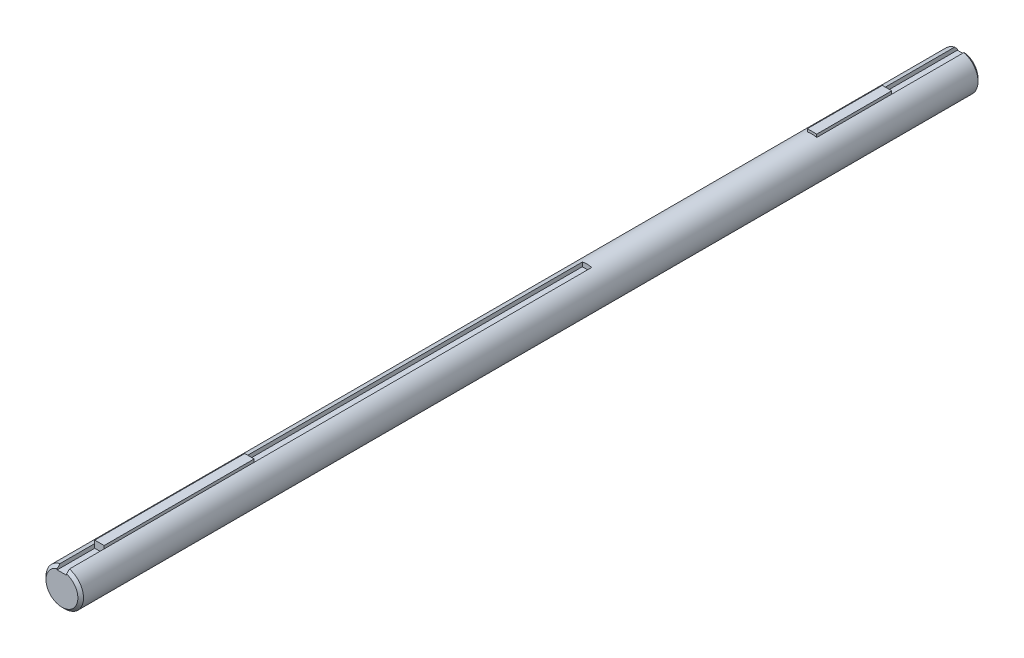
ISO-10303-21;
HEADER;
FILE_DESCRIPTION(('STEP AP214'),'2;1');
FILE_NAME('part.step','',(''),(''),'','','');
FILE_SCHEMA(('AUTOMOTIVE_DESIGN { 1 0 10303 214 1 1 1 1 }'));
ENDSEC;
DATA;
#1=APPLICATION_CONTEXT('core data for automotive mechanical design processes');
#2=APPLICATION_PROTOCOL_DEFINITION('international standard','automotive_design',2000,#1);
#3=PRODUCT_CONTEXT('',#1,'mechanical');
#4=PRODUCT('Part','Part','',(#3));
#5=PRODUCT_RELATED_PRODUCT_CATEGORY('part','',(#4));
#6=PRODUCT_DEFINITION_FORMATION('','',#4);
#7=PRODUCT_DEFINITION_CONTEXT('part definition',#1,'design');
#8=PRODUCT_DEFINITION('design','',#6,#7);
#9=PRODUCT_DEFINITION_SHAPE('','',#8);
#10=(LENGTH_UNIT() NAMED_UNIT(*) SI_UNIT(.MILLI.,.METRE.));
#11=(NAMED_UNIT(*) PLANE_ANGLE_UNIT() SI_UNIT($,.RADIAN.));
#12=(NAMED_UNIT(*) SI_UNIT($,.STERADIAN.) SOLID_ANGLE_UNIT());
#13=UNCERTAINTY_MEASURE_WITH_UNIT(LENGTH_MEASURE(1.E-05),#10,'distance_accuracy_value','');
#14=(GEOMETRIC_REPRESENTATION_CONTEXT(3) GLOBAL_UNCERTAINTY_ASSIGNED_CONTEXT((#13)) GLOBAL_UNIT_ASSIGNED_CONTEXT((#10,
#11,#12)) REPRESENTATION_CONTEXT('',''));
#15=CARTESIAN_POINT('',(0.,0.,0.));
#16=DIRECTION('',(0.,0.,1.));
#17=DIRECTION('',(1.,0.,0.));
#18=AXIS2_PLACEMENT_3D('',#15,#16,#17);
#19=CARTESIAN_POINT('',(-3.175,9.525,-254.));
#20=DIRECTION('',(1.,0.,0.));
#21=DIRECTION('',(0.,1.,0.));
#22=AXIS2_PLACEMENT_3D('',#19,#20,#21);
#23=PLANE('',#22);
#24=DIRECTION('',(0.,1.,0.));
#25=VECTOR('',#24,1.);
#26=CARTESIAN_POINT('',(-3.175,9.525,-203.2));
#27=LINE('',#26,#25);
#28=CARTESIAN_POINT('',(-3.175,9.525,-203.2));
#29=VERTEX_POINT('',#28);
#30=CARTESIAN_POINT('',(-3.175,14.2875,-203.2));
#31=VERTEX_POINT('',#30);
#32=EDGE_CURVE('E107',#29,#31,#27,.T.);
#33=ORIENTED_EDGE('',*,*,#32,.T.);
#34=DIRECTION('',(0.,0.,1.));
#35=VECTOR('',#34,1.);
#36=CARTESIAN_POINT('',(-3.175,14.2875,-254.));
#37=LINE('',#36,#35);
#38=CARTESIAN_POINT('',(-3.175,14.2875,-254.));
#39=VERTEX_POINT('',#38);
#40=EDGE_CURVE('E12',#39,#31,#37,.T.);
#41=ORIENTED_EDGE('',*,*,#40,.F.);
#42=DIRECTION('',(0.,1.,0.));
#43=VECTOR('',#42,1.);
#44=CARTESIAN_POINT('',(-3.175,9.525,-254.));
#45=LINE('',#44,#43);
#46=CARTESIAN_POINT('',(-3.175,9.525,-254.));
#47=VERTEX_POINT('',#46);
#48=EDGE_CURVE('E95',#47,#39,#45,.T.);
#49=ORIENTED_EDGE('',*,*,#48,.F.);
#50=DIRECTION('',(0.,0.,1.));
#51=VECTOR('',#50,1.);
#52=CARTESIAN_POINT('',(-3.175,9.525,-254.));
#53=LINE('',#52,#51);
#54=EDGE_CURVE('E103',#47,#29,#53,.T.);
#55=ORIENTED_EDGE('',*,*,#54,.T.);
#56=EDGE_LOOP('',(#33,#41,#49,#55));
#57=FACE_BOUND('',#56,.T.);
#58=ADVANCED_FACE('F44',(#57),#23,.F.);
#59=CARTESIAN_POINT('',(-3.175,14.2875,-254.));
#60=DIRECTION('',(0.,-1.,0.));
#61=DIRECTION('',(0.,0.,-1.));
#62=AXIS2_PLACEMENT_3D('',#59,#60,#61);
#63=PLANE('',#62);
#64=DIRECTION('',(1.,0.,0.));
#65=VECTOR('',#64,1.);
#66=CARTESIAN_POINT('',(-3.175,14.2875,-203.2));
#67=LINE('',#66,#65);
#68=CARTESIAN_POINT('',(3.175,14.2875,-203.2));
#69=VERTEX_POINT('',#68);
#70=EDGE_CURVE('E99',#31,#69,#67,.T.);
#71=ORIENTED_EDGE('',*,*,#70,.T.);
#72=DIRECTION('',(0.,0.,1.));
#73=VECTOR('',#72,1.);
#74=CARTESIAN_POINT('',(3.175,14.2875,-254.));
#75=LINE('',#74,#73);
#76=CARTESIAN_POINT('',(3.175,14.2875,-254.));
#77=VERTEX_POINT('',#76);
#78=EDGE_CURVE('E52',#77,#69,#75,.T.);
#79=ORIENTED_EDGE('',*,*,#78,.F.);
#80=DIRECTION('',(1.,0.,0.));
#81=VECTOR('',#80,1.);
#82=CARTESIAN_POINT('',(-3.175,14.2875,-254.));
#83=LINE('',#82,#81);
#84=EDGE_CURVE('E90',#39,#77,#83,.T.);
#85=ORIENTED_EDGE('',*,*,#84,.F.);
#86=ORIENTED_EDGE('',*,*,#40,.T.);
#87=EDGE_LOOP('',(#71,#79,#85,#86));
#88=FACE_BOUND('',#87,.T.);
#89=ADVANCED_FACE('F98',(#88),#63,.F.);
#90=CARTESIAN_POINT('',(3.175,14.2875,-254.));
#91=DIRECTION('',(-1.,0.,0.));
#92=DIRECTION('',(0.,-1.,0.));
#93=AXIS2_PLACEMENT_3D('',#90,#91,#92);
#94=PLANE('',#93);
#95=DIRECTION('',(0.,-1.,0.));
#96=VECTOR('',#95,1.);
#97=CARTESIAN_POINT('',(3.175,14.2875,-203.2));
#98=LINE('',#97,#96);
#99=CARTESIAN_POINT('',(3.175,9.525,-203.2));
#100=VERTEX_POINT('',#99);
#101=EDGE_CURVE('E77',#69,#100,#98,.T.);
#102=ORIENTED_EDGE('',*,*,#101,.T.);
#103=DIRECTION('',(0.,0.,1.));
#104=VECTOR('',#103,1.);
#105=CARTESIAN_POINT('',(3.175,9.525,-254.));
#106=LINE('',#105,#104);
#107=CARTESIAN_POINT('',(3.175,9.525,-254.));
#108=VERTEX_POINT('',#107);
#109=EDGE_CURVE('E100',#108,#100,#106,.T.);
#110=ORIENTED_EDGE('',*,*,#109,.F.);
#111=DIRECTION('',(0.,-1.,0.));
#112=VECTOR('',#111,1.);
#113=CARTESIAN_POINT('',(3.175,14.2875,-254.));
#114=LINE('',#113,#112);
#115=EDGE_CURVE('E93',#77,#108,#114,.T.);
#116=ORIENTED_EDGE('',*,*,#115,.F.);
#117=ORIENTED_EDGE('',*,*,#78,.T.);
#118=EDGE_LOOP('',(#102,#110,#116,#117));
#119=FACE_BOUND('',#118,.T.);
#120=ADVANCED_FACE('F101',(#119),#94,.F.);
#121=CARTESIAN_POINT('',(3.175,9.525,-254.));
#122=DIRECTION('',(0.,1.,0.));
#123=DIRECTION('',(0.,0.,1.));
#124=AXIS2_PLACEMENT_3D('',#121,#122,#123);
#125=PLANE('',#124);
#126=DIRECTION('',(-1.,0.,0.));
#127=VECTOR('',#126,1.);
#128=CARTESIAN_POINT('',(3.175,9.525,-203.2));
#129=LINE('',#128,#127);
#130=EDGE_CURVE('E83',#100,#29,#129,.T.);
#131=ORIENTED_EDGE('',*,*,#130,.T.);
#132=ORIENTED_EDGE('',*,*,#54,.F.);
#133=DIRECTION('',(-1.,0.,0.));
#134=VECTOR('',#133,1.);
#135=CARTESIAN_POINT('',(3.175,9.525,-254.));
#136=LINE('',#135,#134);
#137=EDGE_CURVE('E60',#108,#47,#136,.T.);
#138=ORIENTED_EDGE('',*,*,#137,.F.);
#139=ORIENTED_EDGE('',*,*,#109,.T.);
#140=EDGE_LOOP('',(#131,#132,#138,#139));
#141=FACE_BOUND('',#140,.T.);
#142=ADVANCED_FACE('F114',(#141),#125,.F.);
#143=CARTESIAN_POINT('',(-3.175,14.2875,-254.));
#144=DIRECTION('',(0.,0.,-1.));
#145=DIRECTION('',(-1.,0.,0.));
#146=AXIS2_PLACEMENT_3D('',#143,#144,#145);
#147=PLANE('',#146);
#148=ORIENTED_EDGE('',*,*,#48,.T.);
#149=ORIENTED_EDGE('',*,*,#84,.T.);
#150=ORIENTED_EDGE('',*,*,#115,.T.);
#151=ORIENTED_EDGE('',*,*,#137,.T.);
#152=EDGE_LOOP('',(#148,#149,#150,#151));
#153=FACE_BOUND('',#152,.T.);
#154=ADVANCED_FACE('F91',(#153),#147,.T.);
#155=CARTESIAN_POINT('',(-3.175,14.2875,-203.2));
#156=DIRECTION('',(0.,0.,-1.));
#157=DIRECTION('',(-1.,0.,0.));
#158=AXIS2_PLACEMENT_3D('',#155,#156,#157);
#159=PLANE('',#158);
#160=ORIENTED_EDGE('',*,*,#32,.F.);
#161=ORIENTED_EDGE('',*,*,#130,.F.);
#162=ORIENTED_EDGE('',*,*,#101,.F.);
#163=ORIENTED_EDGE('',*,*,#70,.F.);
#164=EDGE_LOOP('',(#160,#161,#162,#163));
#165=FACE_BOUND('',#164,.T.);
#166=ADVANCED_FACE('F117',(#165),#159,.F.);
#167=CLOSED_SHELL('',(#58,#89,#120,#142,#154,#166));
#168=MANIFOLD_SOLID_BREP('B2',#167);
#169=CARTESIAN_POINT('',(-3.175,14.2875,279.4));
#170=DIRECTION('',(1.,0.,0.));
#171=DIRECTION('',(0.,1.,0.));
#172=AXIS2_PLACEMENT_3D('',#169,#170,#171);
#173=PLANE('',#172);
#174=DIRECTION('',(0.,-1.,0.));
#175=VECTOR('',#174,1.);
#176=CARTESIAN_POINT('',(-3.175,14.2875,177.8));
#177=LINE('',#176,#175);
#178=CARTESIAN_POINT('',(-3.175,14.2875,177.8));
#179=VERTEX_POINT('',#178);
#180=CARTESIAN_POINT('',(-3.175,9.525,177.8));
#181=VERTEX_POINT('',#180);
#182=EDGE_CURVE('E241',#179,#181,#177,.T.);
#183=ORIENTED_EDGE('',*,*,#182,.T.);
#184=DIRECTION('',(0.,0.,-1.));
#185=VECTOR('',#184,1.);
#186=CARTESIAN_POINT('',(-3.175,9.525,279.4));
#187=LINE('',#186,#185);
#188=CARTESIAN_POINT('',(-3.175,9.525,279.4));
#189=VERTEX_POINT('',#188);
#190=EDGE_CURVE('E42',#189,#181,#187,.T.);
#191=ORIENTED_EDGE('',*,*,#190,.F.);
#192=DIRECTION('',(0.,-1.,0.));
#193=VECTOR('',#192,1.);
#194=CARTESIAN_POINT('',(-3.175,14.2875,279.4));
#195=LINE('',#194,#193);
#196=CARTESIAN_POINT('',(-3.175,14.2875,279.4));
#197=VERTEX_POINT('',#196);
#198=EDGE_CURVE('E229',#197,#189,#195,.T.);
#199=ORIENTED_EDGE('',*,*,#198,.F.);
#200=DIRECTION('',(0.,0.,-1.));
#201=VECTOR('',#200,1.);
#202=CARTESIAN_POINT('',(-3.175,14.2875,279.4));
#203=LINE('',#202,#201);
#204=EDGE_CURVE('E237',#197,#179,#203,.T.);
#205=ORIENTED_EDGE('',*,*,#204,.T.);
#206=EDGE_LOOP('',(#183,#191,#199,#205));
#207=FACE_BOUND('',#206,.T.);
#208=ADVANCED_FACE('F178',(#207),#173,.F.);
#209=CARTESIAN_POINT('',(-3.175,9.525,279.4));
#210=DIRECTION('',(0.,1.,0.));
#211=DIRECTION('',(0.,0.,1.));
#212=AXIS2_PLACEMENT_3D('',#209,#210,#211);
#213=PLANE('',#212);
#214=DIRECTION('',(1.,0.,0.));
#215=VECTOR('',#214,1.);
#216=CARTESIAN_POINT('',(-3.175,9.525,177.8));
#217=LINE('',#216,#215);
#218=CARTESIAN_POINT('',(3.175,9.525,177.8));
#219=VERTEX_POINT('',#218);
#220=EDGE_CURVE('E233',#181,#219,#217,.T.);
#221=ORIENTED_EDGE('',*,*,#220,.T.);
#222=DIRECTION('',(0.,0.,-1.));
#223=VECTOR('',#222,1.);
#224=CARTESIAN_POINT('',(3.175,9.525,279.4));
#225=LINE('',#224,#223);
#226=CARTESIAN_POINT('',(3.175,9.525,279.4));
#227=VERTEX_POINT('',#226);
#228=EDGE_CURVE('E186',#227,#219,#225,.T.);
#229=ORIENTED_EDGE('',*,*,#228,.F.);
#230=DIRECTION('',(1.,0.,0.));
#231=VECTOR('',#230,1.);
#232=CARTESIAN_POINT('',(-3.175,9.525,279.4));
#233=LINE('',#232,#231);
#234=EDGE_CURVE('E224',#189,#227,#233,.T.);
#235=ORIENTED_EDGE('',*,*,#234,.F.);
#236=ORIENTED_EDGE('',*,*,#190,.T.);
#237=EDGE_LOOP('',(#221,#229,#235,#236));
#238=FACE_BOUND('',#237,.T.);
#239=ADVANCED_FACE('F232',(#238),#213,.F.);
#240=CARTESIAN_POINT('',(3.175,14.2875,279.4));
#241=DIRECTION('',(-1.,0.,0.));
#242=DIRECTION('',(0.,-1.,0.));
#243=AXIS2_PLACEMENT_3D('',#240,#241,#242);
#244=PLANE('',#243);
#245=DIRECTION('',(0.,1.,0.));
#246=VECTOR('',#245,1.);
#247=CARTESIAN_POINT('',(3.175,14.2875,177.8));
#248=LINE('',#247,#246);
#249=CARTESIAN_POINT('',(3.175,14.2875,177.8));
#250=VERTEX_POINT('',#249);
#251=EDGE_CURVE('E211',#219,#250,#248,.T.);
#252=ORIENTED_EDGE('',*,*,#251,.T.);
#253=DIRECTION('',(0.,0.,-1.));
#254=VECTOR('',#253,1.);
#255=CARTESIAN_POINT('',(3.175,14.2875,279.4));
#256=LINE('',#255,#254);
#257=CARTESIAN_POINT('',(3.175,14.2875,279.4));
#258=VERTEX_POINT('',#257);
#259=EDGE_CURVE('E234',#258,#250,#256,.T.);
#260=ORIENTED_EDGE('',*,*,#259,.F.);
#261=DIRECTION('',(0.,1.,0.));
#262=VECTOR('',#261,1.);
#263=CARTESIAN_POINT('',(3.175,14.2875,279.4));
#264=LINE('',#263,#262);
#265=EDGE_CURVE('E227',#227,#258,#264,.T.);
#266=ORIENTED_EDGE('',*,*,#265,.F.);
#267=ORIENTED_EDGE('',*,*,#228,.T.);
#268=EDGE_LOOP('',(#252,#260,#266,#267));
#269=FACE_BOUND('',#268,.T.);
#270=ADVANCED_FACE('F235',(#269),#244,.F.);
#271=CARTESIAN_POINT('',(-3.175,14.2875,279.4));
#272=DIRECTION('',(0.,-1.,0.));
#273=DIRECTION('',(0.,0.,-1.));
#274=AXIS2_PLACEMENT_3D('',#271,#272,#273);
#275=PLANE('',#274);
#276=DIRECTION('',(-1.,0.,0.));
#277=VECTOR('',#276,1.);
#278=CARTESIAN_POINT('',(-3.175,14.2875,177.8));
#279=LINE('',#278,#277);
#280=EDGE_CURVE('E217',#250,#179,#279,.T.);
#281=ORIENTED_EDGE('',*,*,#280,.T.);
#282=ORIENTED_EDGE('',*,*,#204,.F.);
#283=DIRECTION('',(-1.,0.,0.));
#284=VECTOR('',#283,1.);
#285=CARTESIAN_POINT('',(-3.175,14.2875,279.4));
#286=LINE('',#285,#284);
#287=EDGE_CURVE('E194',#258,#197,#286,.T.);
#288=ORIENTED_EDGE('',*,*,#287,.F.);
#289=ORIENTED_EDGE('',*,*,#259,.T.);
#290=EDGE_LOOP('',(#281,#282,#288,#289));
#291=FACE_BOUND('',#290,.T.);
#292=ADVANCED_FACE('F248',(#291),#275,.F.);
#293=CARTESIAN_POINT('',(-3.175,9.525,279.4));
#294=DIRECTION('',(0.,0.,1.));
#295=DIRECTION('',(1.,0.,0.));
#296=AXIS2_PLACEMENT_3D('',#293,#294,#295);
#297=PLANE('',#296);
#298=ORIENTED_EDGE('',*,*,#198,.T.);
#299=ORIENTED_EDGE('',*,*,#234,.T.);
#300=ORIENTED_EDGE('',*,*,#265,.T.);
#301=ORIENTED_EDGE('',*,*,#287,.T.);
#302=EDGE_LOOP('',(#298,#299,#300,#301));
#303=FACE_BOUND('',#302,.T.);
#304=ADVANCED_FACE('F225',(#303),#297,.T.);
#305=CARTESIAN_POINT('',(-3.175,9.525,177.8));
#306=DIRECTION('',(0.,0.,1.));
#307=DIRECTION('',(1.,0.,0.));
#308=AXIS2_PLACEMENT_3D('',#305,#306,#307);
#309=PLANE('',#308);
#310=ORIENTED_EDGE('',*,*,#182,.F.);
#311=ORIENTED_EDGE('',*,*,#280,.F.);
#312=ORIENTED_EDGE('',*,*,#251,.F.);
#313=ORIENTED_EDGE('',*,*,#220,.F.);
#314=EDGE_LOOP('',(#310,#311,#312,#313));
#315=FACE_BOUND('',#314,.T.);
#316=ADVANCED_FACE('F251',(#315),#309,.F.);
#317=CLOSED_SHELL('',(#208,#239,#270,#292,#304,#316));
#318=MANIFOLD_SOLID_BREP('B6',#317);
#319=CARTESIAN_POINT('',(-3.175,12.7,-304.8));
#320=DIRECTION('',(-1.,0.,0.));
#321=DIRECTION('',(0.,-1.,0.));
#322=AXIS2_PLACEMENT_3D('',#319,#320,#321);
#323=PLANE('',#322);
#324=DIRECTION('',(0.,1.,0.));
#325=VECTOR('',#324,1.);
#326=CARTESIAN_POINT('',(-3.175,12.7,-203.2));
#327=LINE('',#326,#325);
#328=CARTESIAN_POINT('',(-3.175,9.525,-203.2));
#329=VERTEX_POINT('',#328);
#330=CARTESIAN_POINT('',(-3.175,12.2967221242085,-203.2));
#331=VERTEX_POINT('',#330);
#332=EDGE_CURVE('E391',#329,#331,#327,.T.);
#333=ORIENTED_EDGE('',*,*,#332,.F.);
#334=DIRECTION('',(0.,0.,1.));
#335=VECTOR('',#334,1.);
#336=CARTESIAN_POINT('',(-3.175,9.525,-304.8));
#337=LINE('',#336,#335);
#338=CARTESIAN_POINT('',(-3.175,9.525,-304.8));
#339=VERTEX_POINT('',#338);
#340=EDGE_CURVE('E381',#339,#329,#337,.T.);
#341=ORIENTED_EDGE('',*,*,#340,.F.);
#342=DIRECTION('',(0.,-1.,0.));
#343=VECTOR('',#342,1.);
#344=CARTESIAN_POINT('',(-3.175,12.7,-304.8));
#345=LINE('',#344,#343);
#346=CARTESIAN_POINT('',(-3.175,10.3175287738871,-304.8));
#347=VERTEX_POINT('',#346);
#348=EDGE_CURVE('E495',#347,#339,#345,.T.);
#349=ORIENTED_EDGE('',*,*,#348,.F.);
#350=CARTESIAN_POINT('',(-3.175,5.00937173024059,-309.664196502013));
#351=CARTESIAN_POINT('',(-3.175,5.12467963968368,-309.566794538701));
#352=CARTESIAN_POINT('',(-3.175,5.23951989911774,-309.468842207621));
#353=CARTESIAN_POINT('',(-3.175,5.46838421759475,-309.271992737128));
#354=CARTESIAN_POINT('',(-3.175,5.58240829263697,-309.173095616323));
#355=CARTESIAN_POINT('',(-3.175,5.92342458066583,-308.875230081458));
#356=CARTESIAN_POINT('',(-3.175,6.14937813584759,-308.675072821867));
#357=CARTESIAN_POINT('',(-3.175,6.59915683005544,-308.272467988588));
#358=CARTESIAN_POINT('',(-3.175,6.8229823416072,-308.070020829871));
#359=CARTESIAN_POINT('',(-3.175,7.26902629652584,-307.663355753249));
#360=CARTESIAN_POINT('',(-3.175,7.49124470438234,-307.459137796434));
#361=CARTESIAN_POINT('',(-3.175,7.93435772993702,-307.04938413778));
#362=CARTESIAN_POINT('',(-3.175,8.15525266801065,-306.843848782028));
#363=CARTESIAN_POINT('',(-3.175,8.5960245703692,-306.43169367339));
#364=CARTESIAN_POINT('',(-3.175,8.81590154254219,-306.225073928935));
#365=CARTESIAN_POINT('',(-3.175,9.47432927903627,-305.603892591144));
#366=CARTESIAN_POINT('',(-3.175,9.9116531867852,-305.188030879735));
#367=CARTESIAN_POINT('',(-3.175,10.7839479781505,-304.354096072104));
#368=CARTESIAN_POINT('',(-3.175,11.2189194878172,-303.936023629402));
#369=CARTESIAN_POINT('',(-3.175,12.0872516822016,-303.098229340112));
#370=CARTESIAN_POINT('',(-3.175,12.5206124025178,-302.678507530401));
#371=CARTESIAN_POINT('',(-3.175,13.3862448514882,-301.837764706774));
#372=CARTESIAN_POINT('',(-3.175,13.8185163366832,-301.416743442379));
#373=CARTESIAN_POINT('',(-3.175,14.6821541051119,-300.573758006437));
#374=CARTESIAN_POINT('',(-3.175,15.1135203721462,-300.151793818291));
#375=CARTESIAN_POINT('',(-3.175,15.5445632058881,-299.729500629924));
#376=B_SPLINE_CURVE_WITH_KNOTS('',3,(#350,#351,#352,#353,#354,#355,#356,#357,#358,#359,#360,
#361,#362,#363,#364,#365,#366,#367,#368,#369,#370,#371,#372,#373,#374,#375),.UNSPECIFIED.,.F.,
.F.,(4,2,2,2,2,2,2,2,2,2,2,2,4),(0.,0.452816810908775,0.905624721024938,1.81117254191713,
2.71655880973225,3.62196502210463,4.52714240548252,5.43231276298784,7.24275040676533,
9.05267984842276,10.86256904994,12.6728321405147,14.4831273549287),.UNSPECIFIED.);
#377=CARTESIAN_POINT('',(-3.175,12.2967221242085,-302.894999999999));
#378=VERTEX_POINT('',#377);
#379=EDGE_CURVE('E424',#347,#378,#376,.T.);
#380=ORIENTED_EDGE('',*,*,#379,.T.);
#381=DIRECTION('',(0.,0.,-1.));
#382=VECTOR('',#381,1.);
#383=CARTESIAN_POINT('',(-3.175,12.2967221242085,304.8));
#384=LINE('',#383,#382);
#385=EDGE_CURVE('E319',#331,#378,#384,.T.);
#386=ORIENTED_EDGE('',*,*,#385,.F.);
#387=EDGE_LOOP('',(#333,#341,#349,#380,#386));
#388=FACE_BOUND('',#387,.T.);
#389=ADVANCED_FACE('F303',(#388),#323,.F.);
#390=CARTESIAN_POINT('',(3.175,12.7,-304.8));
#391=DIRECTION('',(1.,0.,0.));
#392=DIRECTION('',(0.,1.,0.));
#393=AXIS2_PLACEMENT_3D('',#390,#391,#392);
#394=PLANE('',#393);
#395=DIRECTION('',(0.,-1.,0.));
#396=VECTOR('',#395,1.);
#397=CARTESIAN_POINT('',(3.175,12.7,-203.2));
#398=LINE('',#397,#396);
#399=CARTESIAN_POINT('',(3.175,12.2967221242085,-203.2));
#400=VERTEX_POINT('',#399);
#401=CARTESIAN_POINT('',(3.175,9.525,-203.2));
#402=VERTEX_POINT('',#401);
#403=EDGE_CURVE('E396',#400,#402,#398,.T.);
#404=ORIENTED_EDGE('',*,*,#403,.F.);
#405=DIRECTION('',(0.,0.,-1.));
#406=VECTOR('',#405,1.);
#407=CARTESIAN_POINT('',(3.175,12.2967221242085,304.8));
#408=LINE('',#407,#406);
#409=CARTESIAN_POINT('',(3.175,12.2967221242085,-302.894999999999));
#410=VERTEX_POINT('',#409);
#411=EDGE_CURVE('E447',#410,#400,#408,.F.);
#412=ORIENTED_EDGE('',*,*,#411,.F.);
#413=CARTESIAN_POINT('',(3.175,15.5445632058881,-299.729500629924));
#414=CARTESIAN_POINT('',(3.175,15.1135203721462,-300.151793818291));
#415=CARTESIAN_POINT('',(3.175,14.6821541051119,-300.573758006437));
#416=CARTESIAN_POINT('',(3.175,13.8185163366832,-301.416743442379));
#417=CARTESIAN_POINT('',(3.175,13.3862448514881,-301.837764706774));
#418=CARTESIAN_POINT('',(3.175,12.5206124025177,-302.678507530401));
#419=CARTESIAN_POINT('',(3.175,12.0872516822016,-303.098229340112));
#420=CARTESIAN_POINT('',(3.175,11.2189194878172,-303.936023629402));
#421=CARTESIAN_POINT('',(3.175,10.7839479781505,-304.354096072104));
#422=CARTESIAN_POINT('',(3.175,9.91165318678522,-305.188030879735));
#423=CARTESIAN_POINT('',(3.175,9.47432927903628,-305.603892591144));
#424=CARTESIAN_POINT('',(3.175,8.81590154254219,-306.225073928935));
#425=CARTESIAN_POINT('',(3.175,8.5960245703692,-306.43169367339));
#426=CARTESIAN_POINT('',(3.175,8.15525266801065,-306.843848782028));
#427=CARTESIAN_POINT('',(3.175,7.93435772993702,-307.04938413778));
#428=CARTESIAN_POINT('',(3.175,7.49124470438235,-307.459137796434));
#429=CARTESIAN_POINT('',(3.175,7.26902629652586,-307.663355753249));
#430=CARTESIAN_POINT('',(3.175,6.82298234160722,-308.070020829871));
#431=CARTESIAN_POINT('',(3.175,6.59915683005544,-308.272467988588));
#432=CARTESIAN_POINT('',(3.175,6.14937813584759,-308.675072821867));
#433=CARTESIAN_POINT('',(3.175,5.92342458066583,-308.875230081458));
#434=CARTESIAN_POINT('',(3.175,5.58240829263699,-309.173095616323));
#435=CARTESIAN_POINT('',(3.175,5.46838421759479,-309.271992737128));
#436=CARTESIAN_POINT('',(3.175,5.23951989911778,-309.468842207621));
#437=CARTESIAN_POINT('',(3.175,5.1246796396837,-309.566794538701));
#438=CARTESIAN_POINT('',(3.175,5.00937173024059,-309.664196502013));
#439=B_SPLINE_CURVE_WITH_KNOTS('',3,(#413,#414,#415,#416,#417,#418,#419,#420,#421,#422,#423,
#424,#425,#426,#427,#428,#429,#430,#431,#432,#433,#434,#435,#436,#437,#438),.UNSPECIFIED.,.F.,
.F.,(4,2,2,2,2,2,2,2,2,2,2,2,4),(0.,1.81029521441406,3.62055830498876,5.43044750650598,
7.2403769481634,9.0508145919409,9.95598494944621,10.8611623328241,11.7665685451965,
12.6719548130116,13.5775026339038,14.0303105440199,14.4831273549287),.UNSPECIFIED.);
#440=CARTESIAN_POINT('',(3.175,10.3175287738871,-304.8));
#441=VERTEX_POINT('',#440);
#442=EDGE_CURVE('E442',#410,#441,#439,.T.);
#443=ORIENTED_EDGE('',*,*,#442,.T.);
#444=DIRECTION('',(0.,1.,0.));
#445=VECTOR('',#444,1.);
#446=CARTESIAN_POINT('',(3.175,12.7,-304.8));
#447=LINE('',#446,#445);
#448=CARTESIAN_POINT('',(3.175,9.525,-304.8));
#449=VERTEX_POINT('',#448);
#450=EDGE_CURVE('E498',#449,#441,#447,.T.);
#451=ORIENTED_EDGE('',*,*,#450,.F.);
#452=DIRECTION('',(0.,0.,1.));
#453=VECTOR('',#452,1.);
#454=CARTESIAN_POINT('',(3.175,9.525,-304.8));
#455=LINE('',#454,#453);
#456=EDGE_CURVE('E472',#449,#402,#455,.T.);
#457=ORIENTED_EDGE('',*,*,#456,.T.);
#458=EDGE_LOOP('',(#404,#412,#443,#451,#457));
#459=FACE_BOUND('',#458,.T.);
#460=ADVANCED_FACE('F452',(#459),#394,.F.);
#461=CARTESIAN_POINT('',(-3.175,9.525,-304.8));
#462=DIRECTION('',(0.,-1.,0.));
#463=DIRECTION('',(0.,0.,-1.));
#464=AXIS2_PLACEMENT_3D('',#461,#462,#463);
#465=PLANE('',#464);
#466=DIRECTION('',(-1.,0.,0.));
#467=VECTOR('',#466,1.);
#468=CARTESIAN_POINT('',(-3.175,9.525,-203.2));
#469=LINE('',#468,#467);
#470=EDGE_CURVE('E312',#402,#329,#469,.T.);
#471=ORIENTED_EDGE('',*,*,#470,.F.);
#472=ORIENTED_EDGE('',*,*,#456,.F.);
#473=DIRECTION('',(1.,0.,0.));
#474=VECTOR('',#473,1.);
#475=CARTESIAN_POINT('',(-3.175,9.525,-304.8));
#476=LINE('',#475,#474);
#477=EDGE_CURVE('E386',#339,#449,#476,.T.);
#478=ORIENTED_EDGE('',*,*,#477,.F.);
#479=ORIENTED_EDGE('',*,*,#340,.T.);
#480=EDGE_LOOP('',(#471,#472,#478,#479));
#481=FACE_BOUND('',#480,.T.);
#482=ADVANCED_FACE('F382',(#481),#465,.F.);
#483=CARTESIAN_POINT('',(0.,0.,304.8));
#484=DIRECTION('',(0.,0.,-1.));
#485=DIRECTION('',(-1.,0.,0.));
#486=AXIS2_PLACEMENT_3D('',#483,#484,#485);
#487=CYLINDRICAL_SURFACE('',#486,12.7);
#488=CARTESIAN_POINT('',(-3.175,12.2967221242085,302.895));
#489=VERTEX_POINT('',#488);
#490=CARTESIAN_POINT('',(-3.175,12.2967221242085,-50.7999999999998));
#491=VERTEX_POINT('',#490);
#492=EDGE_CURVE('E431',#489,#491,#384,.T.);
#493=ORIENTED_EDGE('',*,*,#492,.T.);
#494=CARTESIAN_POINT('',(0.,0.,-50.8));
#495=DIRECTION('',(0.,0.,1.));
#496=DIRECTION('',(1.,0.,0.));
#497=AXIS2_PLACEMENT_3D('',#494,#495,#496);
#498=CIRCLE('',#497,12.7);
#499=CARTESIAN_POINT('',(3.175,12.2967221242085,-50.7999999999998));
#500=VERTEX_POINT('',#499);
#501=EDGE_CURVE('E473',#500,#491,#498,.T.);
#502=ORIENTED_EDGE('',*,*,#501,.F.);
#503=CARTESIAN_POINT('',(3.175,12.2967221242085,302.895));
#504=VERTEX_POINT('',#503);
#505=EDGE_CURVE('E480',#500,#504,#408,.F.);
#506=ORIENTED_EDGE('',*,*,#505,.T.);
#507=CARTESIAN_POINT('',(0.,0.,302.895));
#508=DIRECTION('',(0.,0.,1.));
#509=DIRECTION('',(1.,0.,0.));
#510=AXIS2_PLACEMENT_3D('',#507,#508,#509);
#511=CIRCLE('',#510,12.7);
#512=EDGE_CURVE('E430',#504,#489,#511,.F.);
#513=ORIENTED_EDGE('',*,*,#512,.T.);
#514=EDGE_LOOP('',(#493,#502,#506,#513));
#515=FACE_BOUND('',#514,.T.);
#516=ORIENTED_EDGE('',*,*,#411,.T.);
#517=CARTESIAN_POINT('',(0.,0.,-203.2));
#518=DIRECTION('',(0.,0.,1.));
#519=DIRECTION('',(1.,0.,0.));
#520=AXIS2_PLACEMENT_3D('',#517,#518,#519);
#521=CIRCLE('',#520,12.7);
#522=EDGE_CURVE('E477',#331,#400,#521,.F.);
#523=ORIENTED_EDGE('',*,*,#522,.F.);
#524=ORIENTED_EDGE('',*,*,#385,.T.);
#525=CARTESIAN_POINT('',(0.,0.,-302.894999999999));
#526=DIRECTION('',(0.,0.,1.));
#527=DIRECTION('',(1.,0.,0.));
#528=AXIS2_PLACEMENT_3D('',#525,#526,#527);
#529=CIRCLE('',#528,12.7);
#530=EDGE_CURVE('E479',#378,#410,#529,.T.);
#531=ORIENTED_EDGE('',*,*,#530,.T.);
#532=EDGE_LOOP('',(#516,#523,#524,#531));
#533=FACE_BOUND('',#532,.T.);
#534=ADVANCED_FACE('F440',(#515,#533),#487,.T.);
#535=CARTESIAN_POINT('',(0.,0.,304.8));
#536=DIRECTION('',(0.,0.,1.));
#537=DIRECTION('',(1.,0.,0.));
#538=AXIS2_PLACEMENT_3D('',#535,#536,#537);
#539=PLANE('',#538);
#540=DIRECTION('',(0.,-1.,0.));
#541=VECTOR('',#540,1.);
#542=CARTESIAN_POINT('',(-3.175,12.7,304.8));
#543=LINE('',#542,#541);
#544=CARTESIAN_POINT('',(-3.175,10.317528773888,304.8));
#545=VERTEX_POINT('',#544);
#546=CARTESIAN_POINT('',(-3.175,9.525,304.8));
#547=VERTEX_POINT('',#546);
#548=EDGE_CURVE('E487',#545,#547,#543,.T.);
#549=ORIENTED_EDGE('',*,*,#548,.F.);
#550=CARTESIAN_POINT('',(0.,0.,304.8));
#551=DIRECTION('',(0.,0.,1.));
#552=DIRECTION('',(1.,0.,0.));
#553=AXIS2_PLACEMENT_3D('',#550,#551,#552);
#554=CIRCLE('',#553,10.7950000000003);
#555=CARTESIAN_POINT('',(3.175,10.317528773888,304.8));
#556=VERTEX_POINT('',#555);
#557=EDGE_CURVE('E513',#545,#556,#554,.T.);
#558=ORIENTED_EDGE('',*,*,#557,.T.);
#559=DIRECTION('',(0.,1.,0.));
#560=VECTOR('',#559,1.);
#561=CARTESIAN_POINT('',(3.175,12.7,304.8));
#562=LINE('',#561,#560);
#563=CARTESIAN_POINT('',(3.175,9.525,304.8));
#564=VERTEX_POINT('',#563);
#565=EDGE_CURVE('E493',#564,#556,#562,.T.);
#566=ORIENTED_EDGE('',*,*,#565,.F.);
#567=DIRECTION('',(1.,0.,0.));
#568=VECTOR('',#567,1.);
#569=CARTESIAN_POINT('',(-3.175,9.525,304.8));
#570=LINE('',#569,#568);
#571=EDGE_CURVE('E490',#547,#564,#570,.T.);
#572=ORIENTED_EDGE('',*,*,#571,.F.);
#573=EDGE_LOOP('',(#549,#558,#566,#572));
#574=FACE_BOUND('',#573,.T.);
#575=ADVANCED_FACE('F420',(#574),#539,.T.);
#576=CARTESIAN_POINT('',(0.,0.,-304.8));
#577=DIRECTION('',(0.,0.,1.));
#578=DIRECTION('',(1.,0.,0.));
#579=AXIS2_PLACEMENT_3D('',#576,#577,#578);
#580=PLANE('',#579);
#581=CARTESIAN_POINT('',(0.,0.,-304.8));
#582=DIRECTION('',(0.,0.,1.));
#583=DIRECTION('',(1.,0.,0.));
#584=AXIS2_PLACEMENT_3D('',#581,#582,#583);
#585=CIRCLE('',#584,10.7949999999995);
#586=EDGE_CURVE('E516',#441,#347,#585,.F.);
#587=ORIENTED_EDGE('',*,*,#586,.T.);
#588=ORIENTED_EDGE('',*,*,#348,.T.);
#589=ORIENTED_EDGE('',*,*,#477,.T.);
#590=ORIENTED_EDGE('',*,*,#450,.T.);
#591=EDGE_LOOP('',(#587,#588,#589,#590));
#592=FACE_BOUND('',#591,.T.);
#593=ADVANCED_FACE('F438',(#592),#580,.F.);
#594=CARTESIAN_POINT('',(0.,0.,-302.894999999999));
#595=DIRECTION('',(0.,0.,1.));
#596=DIRECTION('',(1.,0.,0.));
#597=AXIS2_PLACEMENT_3D('',#594,#595,#596);
#598=CONICAL_SURFACE('',#597,12.7,0.785398163397422);
#599=ORIENTED_EDGE('',*,*,#379,.F.);
#600=ORIENTED_EDGE('',*,*,#586,.F.);
#601=ORIENTED_EDGE('',*,*,#442,.F.);
#602=ORIENTED_EDGE('',*,*,#530,.F.);
#603=EDGE_LOOP('',(#599,#600,#601,#602));
#604=FACE_BOUND('',#603,.T.);
#605=ADVANCED_FACE('F434',(#604),#598,.T.);
#606=CARTESIAN_POINT('',(0.,0.,304.8));
#607=DIRECTION('',(0.,0.,-1.));
#608=DIRECTION('',(-1.,0.,0.));
#609=AXIS2_PLACEMENT_3D('',#606,#607,#608);
#610=CONICAL_SURFACE('',#609,10.7950000000003,0.785398163397437);
#611=CARTESIAN_POINT('',(-3.175,15.5445632058881,299.729500629925));
#612=CARTESIAN_POINT('',(-3.175,15.1135203721462,300.151793818292));
#613=CARTESIAN_POINT('',(-3.175,14.682154105112,300.573758006438));
#614=CARTESIAN_POINT('',(-3.175,13.8185163366833,301.416743442379));
#615=CARTESIAN_POINT('',(-3.175,13.3862448514883,301.837764706775));
#616=CARTESIAN_POINT('',(-3.175,12.5206124025179,302.678507530402));
#617=CARTESIAN_POINT('',(-3.175,12.0872516822018,303.098229340112));
#618=CARTESIAN_POINT('',(-3.175,11.2189194878174,303.936023629403));
#619=CARTESIAN_POINT('',(-3.175,10.7839479781508,304.354096072105));
#620=CARTESIAN_POINT('',(-3.175,9.91165318678552,305.188030879735));
#621=CARTESIAN_POINT('',(-3.175,9.47432927903662,305.603892591145));
#622=CARTESIAN_POINT('',(-3.175,8.81590154254257,306.225073928935));
#623=CARTESIAN_POINT('',(-3.175,8.59602457036959,306.431693673391));
#624=CARTESIAN_POINT('',(-3.175,8.15525266801107,306.843848782028));
#625=CARTESIAN_POINT('',(-3.175,7.93435772993746,307.04938413778));
#626=CARTESIAN_POINT('',(-3.175,7.49124470438281,307.459137796434));
#627=CARTESIAN_POINT('',(-3.175,7.26902629652633,307.663355753249));
#628=CARTESIAN_POINT('',(-3.175,6.8229823416077,308.070020829871));
#629=CARTESIAN_POINT('',(-3.175,6.59915683005593,308.272467988588));
#630=CARTESIAN_POINT('',(-3.175,6.14937813584813,308.675072821867));
#631=CARTESIAN_POINT('',(-3.175,5.9234245806664,308.875230081458));
#632=CARTESIAN_POINT('',(-3.175,5.58240829263755,309.173095616324));
#633=CARTESIAN_POINT('',(-3.175,5.46838421759533,309.271992737128));
#634=CARTESIAN_POINT('',(-3.175,5.23951989911831,309.468842207622));
#635=CARTESIAN_POINT('',(-3.175,5.12467963968425,309.566794538701));
#636=CARTESIAN_POINT('',(-3.175,5.00937173024117,309.664196502013));
#637=B_SPLINE_CURVE_WITH_KNOTS('',3,(#611,#612,#613,#614,#615,#616,#617,#618,#619,#620,#621,
#622,#623,#624,#625,#626,#627,#628,#629,#630,#631,#632,#633,#634,#635,#636),.UNSPECIFIED.,.F.,
.F.,(4,2,2,2,2,2,2,2,2,2,2,2,4),(0.,1.81029521441391,3.62055830498849,5.43044750650564,
7.24037694816294,9.05081459194034,9.95598494944554,10.8611623328234,11.7665685451957,
12.6719548130107,13.5775026339029,14.030310544019,14.4831273549278),.UNSPECIFIED.);
#638=EDGE_CURVE('E400',#489,#545,#637,.T.);
#639=ORIENTED_EDGE('',*,*,#638,.F.);
#640=ORIENTED_EDGE('',*,*,#512,.F.);
#641=CARTESIAN_POINT('',(3.175,5.00937173024117,309.664196502013));
#642=CARTESIAN_POINT('',(3.175,5.12467963968427,309.566794538701));
#643=CARTESIAN_POINT('',(3.175,5.23951989911832,309.468842207622));
#644=CARTESIAN_POINT('',(3.175,5.46838421759531,309.271992737128));
#645=CARTESIAN_POINT('',(3.175,5.58240829263752,309.173095616324));
#646=CARTESIAN_POINT('',(3.175,5.92342458066636,308.875230081458));
#647=CARTESIAN_POINT('',(3.175,6.14937813584811,308.675072821867));
#648=CARTESIAN_POINT('',(3.175,6.59915683005594,308.272467988588));
#649=CARTESIAN_POINT('',(3.175,6.8229823416077,308.070020829871));
#650=CARTESIAN_POINT('',(3.175,7.26902629652632,307.663355753249));
#651=CARTESIAN_POINT('',(3.175,7.49124470438281,307.459137796434));
#652=CARTESIAN_POINT('',(3.175,7.93435772993746,307.04938413778));
#653=CARTESIAN_POINT('',(3.175,8.15525266801107,306.843848782028));
#654=CARTESIAN_POINT('',(3.175,8.59602457036959,306.431693673391));
#655=CARTESIAN_POINT('',(3.175,8.81590154254257,306.225073928935));
#656=CARTESIAN_POINT('',(3.175,9.47432927903662,305.603892591145));
#657=CARTESIAN_POINT('',(3.175,9.91165318678551,305.188030879735));
#658=CARTESIAN_POINT('',(3.175,10.7839479781507,304.354096072105));
#659=CARTESIAN_POINT('',(3.175,11.2189194878174,303.936023629403));
#660=CARTESIAN_POINT('',(3.175,12.0872516822018,303.098229340112));
#661=CARTESIAN_POINT('',(3.175,12.5206124025179,302.678507530402));
#662=CARTESIAN_POINT('',(3.175,13.3862448514883,301.837764706775));
#663=CARTESIAN_POINT('',(3.175,13.8185163366833,301.416743442379));
#664=CARTESIAN_POINT('',(3.175,14.682154105112,300.573758006438));
#665=CARTESIAN_POINT('',(3.175,15.1135203721462,300.151793818292));
#666=CARTESIAN_POINT('',(3.175,15.5445632058881,299.729500629925));
#667=B_SPLINE_CURVE_WITH_KNOTS('',3,(#641,#642,#643,#644,#645,#646,#647,#648,#649,#650,#651,
#652,#653,#654,#655,#656,#657,#658,#659,#660,#661,#662,#663,#664,#665,#666),.UNSPECIFIED.,.F.,
.F.,(4,2,2,2,2,2,2,2,2,2,2,2,4),(0.,0.452816810908727,0.90562472102488,1.81117254191705,
2.71655880973211,3.62196502210443,4.52714240548225,5.43231276298745,7.24275040676485,
9.05267984842209,10.8625690499393,12.6728321405139,14.4831273549278),.UNSPECIFIED.);
#668=EDGE_CURVE('E401',#556,#504,#667,.T.);
#669=ORIENTED_EDGE('',*,*,#668,.F.);
#670=ORIENTED_EDGE('',*,*,#557,.F.);
#671=EDGE_LOOP('',(#639,#640,#669,#670));
#672=FACE_BOUND('',#671,.T.);
#673=ADVANCED_FACE('F305',(#672),#610,.T.);
#674=CARTESIAN_POINT('',(-3.175,9.525,-50.8000000000001));
#675=VERTEX_POINT('',#674);
#676=EDGE_CURVE('E389',#675,#547,#337,.T.);
#677=ORIENTED_EDGE('',*,*,#676,.F.);
#678=DIRECTION('',(0.,1.,0.));
#679=VECTOR('',#678,1.);
#680=CARTESIAN_POINT('',(-3.175,12.7,-50.8));
#681=LINE('',#680,#679);
#682=EDGE_CURVE('E327',#675,#491,#681,.T.);
#683=ORIENTED_EDGE('',*,*,#682,.T.);
#684=ORIENTED_EDGE('',*,*,#492,.F.);
#685=ORIENTED_EDGE('',*,*,#638,.T.);
#686=ORIENTED_EDGE('',*,*,#548,.T.);
#687=EDGE_LOOP('',(#677,#683,#684,#685,#686));
#688=FACE_BOUND('',#687,.T.);
#689=ADVANCED_FACE('F413',(#688),#323,.F.);
#690=ORIENTED_EDGE('',*,*,#505,.F.);
#691=DIRECTION('',(0.,-1.,0.));
#692=VECTOR('',#691,1.);
#693=CARTESIAN_POINT('',(3.175,12.7,-50.8));
#694=LINE('',#693,#692);
#695=CARTESIAN_POINT('',(3.175,9.525,-50.8000000000001));
#696=VERTEX_POINT('',#695);
#697=EDGE_CURVE('E395',#500,#696,#694,.T.);
#698=ORIENTED_EDGE('',*,*,#697,.T.);
#699=EDGE_CURVE('E388',#696,#564,#455,.T.);
#700=ORIENTED_EDGE('',*,*,#699,.T.);
#701=ORIENTED_EDGE('',*,*,#565,.T.);
#702=ORIENTED_EDGE('',*,*,#668,.T.);
#703=EDGE_LOOP('',(#690,#698,#700,#701,#702));
#704=FACE_BOUND('',#703,.T.);
#705=ADVANCED_FACE('F418',(#704),#394,.F.);
#706=ORIENTED_EDGE('',*,*,#699,.F.);
#707=DIRECTION('',(-1.,0.,0.));
#708=VECTOR('',#707,1.);
#709=CARTESIAN_POINT('',(-3.175,9.525,-50.8));
#710=LINE('',#709,#708);
#711=EDGE_CURVE('E176',#696,#675,#710,.T.);
#712=ORIENTED_EDGE('',*,*,#711,.T.);
#713=ORIENTED_EDGE('',*,*,#676,.T.);
#714=ORIENTED_EDGE('',*,*,#571,.T.);
#715=EDGE_LOOP('',(#706,#712,#713,#714));
#716=FACE_BOUND('',#715,.T.);
#717=ADVANCED_FACE('F419',(#716),#465,.F.);
#718=CARTESIAN_POINT('',(0.,0.,-50.8));
#719=DIRECTION('',(0.,0.,1.));
#720=DIRECTION('',(1.,0.,0.));
#721=AXIS2_PLACEMENT_3D('',#718,#719,#720);
#722=PLANE('',#721);
#723=ORIENTED_EDGE('',*,*,#682,.F.);
#724=ORIENTED_EDGE('',*,*,#711,.F.);
#725=ORIENTED_EDGE('',*,*,#697,.F.);
#726=ORIENTED_EDGE('',*,*,#501,.T.);
#727=EDGE_LOOP('',(#723,#724,#725,#726));
#728=FACE_BOUND('',#727,.T.);
#729=ADVANCED_FACE('F453',(#728),#722,.T.);
#730=CARTESIAN_POINT('',(0.,0.,-203.2));
#731=DIRECTION('',(0.,0.,1.));
#732=DIRECTION('',(1.,0.,0.));
#733=AXIS2_PLACEMENT_3D('',#730,#731,#732);
#734=PLANE('',#733);
#735=ORIENTED_EDGE('',*,*,#470,.T.);
#736=ORIENTED_EDGE('',*,*,#332,.T.);
#737=ORIENTED_EDGE('',*,*,#522,.T.);
#738=ORIENTED_EDGE('',*,*,#403,.T.);
#739=EDGE_LOOP('',(#735,#736,#737,#738));
#740=FACE_BOUND('',#739,.T.);
#741=ADVANCED_FACE('F399',(#740),#734,.F.);
#742=CLOSED_SHELL('',(#389,#460,#482,#534,#575,#593,#605,#673,#689,#705,#717,#729,#741));
#743=MANIFOLD_SOLID_BREP('B36',#742);
#744=ADVANCED_BREP_SHAPE_REPRESENTATION('',(#18,#168,#318,#743),#14);
#745=SHAPE_DEFINITION_REPRESENTATION(#9,#744);
ENDSEC;
END-ISO-10303-21;
